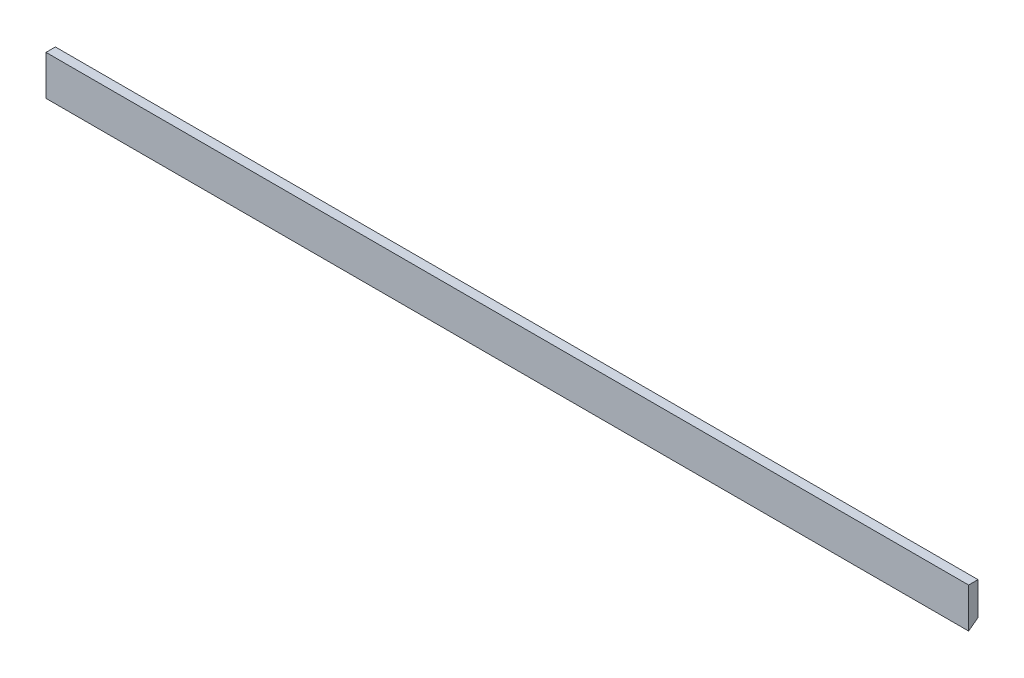
ISO-10303-21;
HEADER;
FILE_DESCRIPTION(('STEP AP214'),'2;1');
FILE_NAME('part.step','',(''),(''),'','','');
FILE_SCHEMA(('AUTOMOTIVE_DESIGN { 1 0 10303 214 1 1 1 1 }'));
ENDSEC;
DATA;
#1=APPLICATION_CONTEXT('core data for automotive mechanical design processes');
#2=APPLICATION_PROTOCOL_DEFINITION('international standard','automotive_design',2000,#1);
#3=PRODUCT_CONTEXT('',#1,'mechanical');
#4=PRODUCT('Part','Part','',(#3));
#5=PRODUCT_RELATED_PRODUCT_CATEGORY('part','',(#4));
#6=PRODUCT_DEFINITION_FORMATION('','',#4);
#7=PRODUCT_DEFINITION_CONTEXT('part definition',#1,'design');
#8=PRODUCT_DEFINITION('design','',#6,#7);
#9=PRODUCT_DEFINITION_SHAPE('','',#8);
#10=(LENGTH_UNIT() NAMED_UNIT(*) SI_UNIT(.MILLI.,.METRE.));
#11=(NAMED_UNIT(*) PLANE_ANGLE_UNIT() SI_UNIT($,.RADIAN.));
#12=(NAMED_UNIT(*) SI_UNIT($,.STERADIAN.) SOLID_ANGLE_UNIT());
#13=UNCERTAINTY_MEASURE_WITH_UNIT(LENGTH_MEASURE(1.E-05),#10,'distance_accuracy_value','');
#14=(GEOMETRIC_REPRESENTATION_CONTEXT(3) GLOBAL_UNCERTAINTY_ASSIGNED_CONTEXT((#13)) GLOBAL_UNIT_ASSIGNED_CONTEXT((#10,
#11,#12)) REPRESENTATION_CONTEXT('',''));
#15=CARTESIAN_POINT('',(0.,0.,0.));
#16=DIRECTION('',(0.,0.,1.));
#17=DIRECTION('',(1.,0.,0.));
#18=AXIS2_PLACEMENT_3D('',#15,#16,#17);
#19=CARTESIAN_POINT('',(312.1,6.745,-1.5875));
#20=DIRECTION('',(0.,0.,1.));
#21=DIRECTION('',(0.,-1.,0.));
#22=AXIS2_PLACEMENT_3D('',#19,#20,#21);
#23=PLANE('',#22);
#24=DIRECTION('',(0.,1.,0.));
#25=VECTOR('',#24,1.);
#26=CARTESIAN_POINT('',(312.1,6.745,-1.5875));
#27=LINE('',#26,#25);
#28=CARTESIAN_POINT('',(312.1,-4.39562358678452,-1.5875));
#29=VERTEX_POINT('',#28);
#30=CARTESIAN_POINT('',(312.1,6.745,-1.5875));
#31=VERTEX_POINT('',#30);
#32=EDGE_CURVE('E77',#29,#31,#27,.T.);
#33=ORIENTED_EDGE('',*,*,#32,.F.);
#34=DIRECTION('',(-1.,0.,0.));
#35=VECTOR('',#34,1.);
#36=CARTESIAN_POINT('',(312.1,-4.39562358678452,-1.5875));
#37=LINE('',#36,#35);
#38=CARTESIAN_POINT('',(0.,-4.39562358678452,-1.5875));
#39=VERTEX_POINT('',#38);
#40=EDGE_CURVE('E97',#29,#39,#37,.T.);
#41=ORIENTED_EDGE('',*,*,#40,.T.);
#42=DIRECTION('',(0.,1.,0.));
#43=VECTOR('',#42,1.);
#44=CARTESIAN_POINT('',(0.,6.745,-1.5875));
#45=LINE('',#44,#43);
#46=CARTESIAN_POINT('',(0.,6.745,-1.5875));
#47=VERTEX_POINT('',#46);
#48=EDGE_CURVE('E100',#39,#47,#45,.T.);
#49=ORIENTED_EDGE('',*,*,#48,.T.);
#50=DIRECTION('',(-1.,0.,0.));
#51=VECTOR('',#50,1.);
#52=CARTESIAN_POINT('',(312.1,6.745,-1.5875));
#53=LINE('',#52,#51);
#54=EDGE_CURVE('E89',#31,#47,#53,.T.);
#55=ORIENTED_EDGE('',*,*,#54,.F.);
#56=EDGE_LOOP('',(#33,#41,#49,#55));
#57=FACE_BOUND('',#56,.T.);
#58=ADVANCED_FACE('F41',(#57),#23,.F.);
#59=CARTESIAN_POINT('',(312.1,6.745,1.5875));
#60=DIRECTION('',(0.,-1.,0.));
#61=DIRECTION('',(0.,0.,-1.));
#62=AXIS2_PLACEMENT_3D('',#59,#60,#61);
#63=PLANE('',#62);
#64=DIRECTION('',(0.,0.,1.));
#65=VECTOR('',#64,1.);
#66=CARTESIAN_POINT('',(0.,6.745,1.5875));
#67=LINE('',#66,#65);
#68=CARTESIAN_POINT('',(0.,6.745,1.5875));
#69=VERTEX_POINT('',#68);
#70=EDGE_CURVE('E115',#47,#69,#67,.T.);
#71=ORIENTED_EDGE('',*,*,#70,.T.);
#72=DIRECTION('',(-1.,0.,0.));
#73=VECTOR('',#72,1.);
#74=CARTESIAN_POINT('',(312.1,6.745,1.5875));
#75=LINE('',#74,#73);
#76=CARTESIAN_POINT('',(312.1,6.745,1.5875));
#77=VERTEX_POINT('',#76);
#78=EDGE_CURVE('E95',#77,#69,#75,.T.);
#79=ORIENTED_EDGE('',*,*,#78,.F.);
#80=DIRECTION('',(0.,0.,1.));
#81=VECTOR('',#80,1.);
#82=CARTESIAN_POINT('',(312.1,6.745,1.5875));
#83=LINE('',#82,#81);
#84=EDGE_CURVE('E82',#31,#77,#83,.T.);
#85=ORIENTED_EDGE('',*,*,#84,.F.);
#86=ORIENTED_EDGE('',*,*,#54,.T.);
#87=EDGE_LOOP('',(#71,#79,#85,#86));
#88=FACE_BOUND('',#87,.T.);
#89=ADVANCED_FACE('F90',(#88),#63,.F.);
#90=CARTESIAN_POINT('',(312.1,6.745,1.5875));
#91=DIRECTION('',(0.,0.,-1.));
#92=DIRECTION('',(0.,1.,0.));
#93=AXIS2_PLACEMENT_3D('',#90,#91,#92);
#94=PLANE('',#93);
#95=DIRECTION('',(0.,-1.,0.));
#96=VECTOR('',#95,1.);
#97=CARTESIAN_POINT('',(0.,6.745,1.5875));
#98=LINE('',#97,#96);
#99=CARTESIAN_POINT('',(0.,-6.745,1.5875));
#100=VERTEX_POINT('',#99);
#101=EDGE_CURVE('E83',#69,#100,#98,.T.);
#102=ORIENTED_EDGE('',*,*,#101,.T.);
#103=DIRECTION('',(-1.,0.,0.));
#104=VECTOR('',#103,1.);
#105=CARTESIAN_POINT('',(312.1,-6.745,1.5875));
#106=LINE('',#105,#104);
#107=CARTESIAN_POINT('',(312.1,-6.745,1.5875));
#108=VERTEX_POINT('',#107);
#109=EDGE_CURVE('E105',#108,#100,#106,.T.);
#110=ORIENTED_EDGE('',*,*,#109,.F.);
#111=DIRECTION('',(0.,-1.,0.));
#112=VECTOR('',#111,1.);
#113=CARTESIAN_POINT('',(312.1,6.745,1.5875));
#114=LINE('',#113,#112);
#115=EDGE_CURVE('E94',#77,#108,#114,.T.);
#116=ORIENTED_EDGE('',*,*,#115,.F.);
#117=ORIENTED_EDGE('',*,*,#78,.T.);
#118=EDGE_LOOP('',(#102,#110,#116,#117));
#119=FACE_BOUND('',#118,.T.);
#120=ADVANCED_FACE('F112',(#119),#94,.F.);
#121=CARTESIAN_POINT('',(312.1,0.,0.));
#122=DIRECTION('',(1.,0.,0.));
#123=DIRECTION('',(0.,0.,-1.));
#124=AXIS2_PLACEMENT_3D('',#121,#122,#123);
#125=PLANE('',#124);
#126=ORIENTED_EDGE('',*,*,#115,.T.);
#127=DIRECTION('',(0.,-0.594822786751341,0.803856860617218));
#128=VECTOR('',#127,1.);
#129=CARTESIAN_POINT('',(312.1,-3.59945667413175,-2.663457830109));
#130=LINE('',#129,#128);
#131=EDGE_CURVE('E11',#108,#29,#130,.F.);
#132=ORIENTED_EDGE('',*,*,#131,.T.);
#133=ORIENTED_EDGE('',*,*,#32,.T.);
#134=ORIENTED_EDGE('',*,*,#84,.T.);
#135=EDGE_LOOP('',(#126,#132,#133,#134));
#136=FACE_BOUND('',#135,.T.);
#137=ADVANCED_FACE('F79',(#136),#125,.T.);
#138=CARTESIAN_POINT('',(0.,0.,0.));
#139=DIRECTION('',(1.,0.,0.));
#140=DIRECTION('',(0.,0.,-1.));
#141=AXIS2_PLACEMENT_3D('',#138,#139,#140);
#142=PLANE('',#141);
#143=ORIENTED_EDGE('',*,*,#48,.F.);
#144=DIRECTION('',(0.,0.594822786751341,-0.803856860617218));
#145=VECTOR('',#144,1.);
#146=CARTESIAN_POINT('',(0.,-4.39562358678452,-1.5875));
#147=LINE('',#146,#145);
#148=EDGE_CURVE('E49',#39,#100,#147,.F.);
#149=ORIENTED_EDGE('',*,*,#148,.T.);
#150=ORIENTED_EDGE('',*,*,#101,.F.);
#151=ORIENTED_EDGE('',*,*,#70,.F.);
#152=EDGE_LOOP('',(#143,#149,#150,#151));
#153=FACE_BOUND('',#152,.T.);
#154=ADVANCED_FACE('F107',(#153),#142,.F.);
#155=CARTESIAN_POINT('',(312.1,-4.39562358678452,-1.5875));
#156=DIRECTION('',(0.,0.803856860617218,0.594822786751341));
#157=DIRECTION('',(-1.,0.,0.));
#158=AXIS2_PLACEMENT_3D('',#155,#156,#157);
#159=PLANE('',#158);
#160=ORIENTED_EDGE('',*,*,#131,.F.);
#161=ORIENTED_EDGE('',*,*,#109,.T.);
#162=ORIENTED_EDGE('',*,*,#148,.F.);
#163=ORIENTED_EDGE('',*,*,#40,.F.);
#164=EDGE_LOOP('',(#160,#161,#162,#163));
#165=FACE_BOUND('',#164,.T.);
#166=ADVANCED_FACE('F42',(#165),#159,.F.);
#167=CLOSED_SHELL('',(#58,#89,#120,#137,#154,#166));
#168=MANIFOLD_SOLID_BREP('B2',#167);
#169=ADVANCED_BREP_SHAPE_REPRESENTATION('',(#18,#168),#14);
#170=SHAPE_DEFINITION_REPRESENTATION(#9,#169);
ENDSEC;
END-ISO-10303-21;
